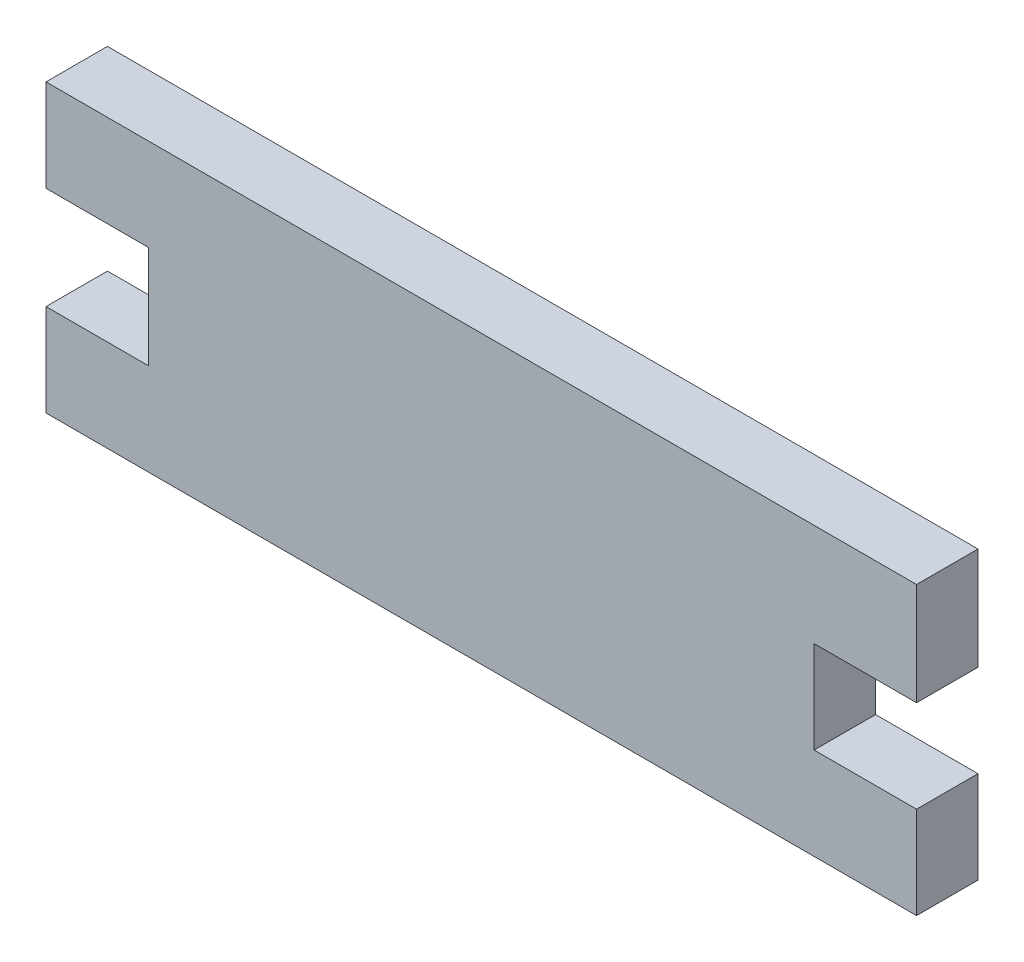
ISO-10303-21;
HEADER;
FILE_DESCRIPTION(('STEP AP214'),'2;1');
FILE_NAME('part.step','',(''),(''),'','','');
FILE_SCHEMA(('AUTOMOTIVE_DESIGN { 1 0 10303 214 1 1 1 1 }'));
ENDSEC;
DATA;
#1=APPLICATION_CONTEXT('core data for automotive mechanical design processes');
#2=APPLICATION_PROTOCOL_DEFINITION('international standard','automotive_design',2000,#1);
#3=PRODUCT_CONTEXT('',#1,'mechanical');
#4=PRODUCT('Part','Part','',(#3));
#5=PRODUCT_RELATED_PRODUCT_CATEGORY('part','',(#4));
#6=PRODUCT_DEFINITION_FORMATION('','',#4);
#7=PRODUCT_DEFINITION_CONTEXT('part definition',#1,'design');
#8=PRODUCT_DEFINITION('design','',#6,#7);
#9=PRODUCT_DEFINITION_SHAPE('','',#8);
#10=(LENGTH_UNIT() NAMED_UNIT(*) SI_UNIT(.MILLI.,.METRE.));
#11=(NAMED_UNIT(*) PLANE_ANGLE_UNIT() SI_UNIT($,.RADIAN.));
#12=(NAMED_UNIT(*) SI_UNIT($,.STERADIAN.) SOLID_ANGLE_UNIT());
#13=UNCERTAINTY_MEASURE_WITH_UNIT(LENGTH_MEASURE(1.E-05),#10,'distance_accuracy_value','');
#14=(GEOMETRIC_REPRESENTATION_CONTEXT(3) GLOBAL_UNCERTAINTY_ASSIGNED_CONTEXT((#13)) GLOBAL_UNIT_ASSIGNED_CONTEXT((#10,
#11,#12)) REPRESENTATION_CONTEXT('',''));
#15=CARTESIAN_POINT('',(0.,0.,0.));
#16=DIRECTION('',(0.,0.,1.));
#17=DIRECTION('',(1.,0.,0.));
#18=AXIS2_PLACEMENT_3D('',#15,#16,#17);
#19=CARTESIAN_POINT('',(-16.5096417663684,7.16357235269553,3.));
#20=DIRECTION('',(1.,0.,0.));
#21=DIRECTION('',(0.,0.,-1.));
#22=AXIS2_PLACEMENT_3D('',#19,#20,#21);
#23=PLANE('',#22);
#24=DIRECTION('',(0.,-1.,0.));
#25=VECTOR('',#24,1.);
#26=CARTESIAN_POINT('',(-16.5096417663684,7.16357235269553,0.));
#27=LINE('',#26,#25);
#28=CARTESIAN_POINT('',(-16.5096417663684,7.16357235269553,0.));
#29=VERTEX_POINT('',#28);
#30=CARTESIAN_POINT('',(-16.5096417663684,2.66357235269553,0.));
#31=VERTEX_POINT('',#30);
#32=EDGE_CURVE('E157',#29,#31,#27,.T.);
#33=ORIENTED_EDGE('',*,*,#32,.T.);
#34=DIRECTION('',(0.,0.,-1.));
#35=VECTOR('',#34,1.);
#36=CARTESIAN_POINT('',(-16.5096417663684,2.66357235269553,3.));
#37=LINE('',#36,#35);
#38=CARTESIAN_POINT('',(-16.5096417663684,2.66357235269553,3.));
#39=VERTEX_POINT('',#38);
#40=EDGE_CURVE('E11',#39,#31,#37,.T.);
#41=ORIENTED_EDGE('',*,*,#40,.F.);
#42=DIRECTION('',(0.,-1.,0.));
#43=VECTOR('',#42,1.);
#44=CARTESIAN_POINT('',(-16.5096417663684,7.16357235269553,3.));
#45=LINE('',#44,#43);
#46=CARTESIAN_POINT('',(-16.5096417663684,7.16357235269553,3.));
#47=VERTEX_POINT('',#46);
#48=EDGE_CURVE('E179',#47,#39,#45,.T.);
#49=ORIENTED_EDGE('',*,*,#48,.F.);
#50=DIRECTION('',(0.,0.,-1.));
#51=VECTOR('',#50,1.);
#52=CARTESIAN_POINT('',(-16.5096417663684,7.16357235269553,3.));
#53=LINE('',#52,#51);
#54=EDGE_CURVE('E153',#47,#29,#53,.T.);
#55=ORIENTED_EDGE('',*,*,#54,.T.);
#56=EDGE_LOOP('',(#33,#41,#49,#55));
#57=FACE_BOUND('',#56,.T.);
#58=ADVANCED_FACE('F37',(#57),#23,.F.);
#59=CARTESIAN_POINT('',(-16.5096417663684,2.66357235269553,3.));
#60=DIRECTION('',(0.,1.,0.));
#61=DIRECTION('',(-1.,0.,0.));
#62=AXIS2_PLACEMENT_3D('',#59,#60,#61);
#63=PLANE('',#62);
#64=DIRECTION('',(1.,0.,0.));
#65=VECTOR('',#64,1.);
#66=CARTESIAN_POINT('',(-16.5096417663684,2.66357235269553,0.));
#67=LINE('',#66,#65);
#68=CARTESIAN_POINT('',(-11.5096417663684,2.66357235269553,0.));
#69=VERTEX_POINT('',#68);
#70=EDGE_CURVE('E160',#31,#69,#67,.T.);
#71=ORIENTED_EDGE('',*,*,#70,.T.);
#72=DIRECTION('',(0.,0.,-1.));
#73=VECTOR('',#72,1.);
#74=CARTESIAN_POINT('',(-11.5096417663684,2.66357235269553,3.));
#75=LINE('',#74,#73);
#76=CARTESIAN_POINT('',(-11.5096417663684,2.66357235269553,3.));
#77=VERTEX_POINT('',#76);
#78=EDGE_CURVE('E45',#77,#69,#75,.T.);
#79=ORIENTED_EDGE('',*,*,#78,.F.);
#80=DIRECTION('',(1.,0.,0.));
#81=VECTOR('',#80,1.);
#82=CARTESIAN_POINT('',(-16.5096417663684,2.66357235269553,3.));
#83=LINE('',#82,#81);
#84=EDGE_CURVE('E108',#39,#77,#83,.T.);
#85=ORIENTED_EDGE('',*,*,#84,.F.);
#86=ORIENTED_EDGE('',*,*,#40,.T.);
#87=EDGE_LOOP('',(#71,#79,#85,#86));
#88=FACE_BOUND('',#87,.T.);
#89=ADVANCED_FACE('F257',(#88),#63,.F.);
#90=CARTESIAN_POINT('',(-11.5096417663684,2.66357235269553,3.));
#91=DIRECTION('',(1.,0.,0.));
#92=DIRECTION('',(0.,1.,0.));
#93=AXIS2_PLACEMENT_3D('',#90,#91,#92);
#94=PLANE('',#93);
#95=DIRECTION('',(0.,-1.,0.));
#96=VECTOR('',#95,1.);
#97=CARTESIAN_POINT('',(-11.5096417663684,2.66357235269553,0.));
#98=LINE('',#97,#96);
#99=CARTESIAN_POINT('',(-11.5096417663684,-2.33642764730447,0.));
#100=VERTEX_POINT('',#99);
#101=EDGE_CURVE('E162',#69,#100,#98,.T.);
#102=ORIENTED_EDGE('',*,*,#101,.T.);
#103=DIRECTION('',(0.,0.,-1.));
#104=VECTOR('',#103,1.);
#105=CARTESIAN_POINT('',(-11.5096417663684,-2.33642764730447,3.));
#106=LINE('',#105,#104);
#107=CARTESIAN_POINT('',(-11.5096417663684,-2.33642764730447,3.));
#108=VERTEX_POINT('',#107);
#109=EDGE_CURVE('E198',#108,#100,#106,.T.);
#110=ORIENTED_EDGE('',*,*,#109,.F.);
#111=DIRECTION('',(0.,-1.,0.));
#112=VECTOR('',#111,1.);
#113=CARTESIAN_POINT('',(-11.5096417663684,2.66357235269553,3.));
#114=LINE('',#113,#112);
#115=EDGE_CURVE('E206',#77,#108,#114,.T.);
#116=ORIENTED_EDGE('',*,*,#115,.F.);
#117=ORIENTED_EDGE('',*,*,#78,.T.);
#118=EDGE_LOOP('',(#102,#110,#116,#117));
#119=FACE_BOUND('',#118,.T.);
#120=ADVANCED_FACE('F204',(#119),#94,.F.);
#121=CARTESIAN_POINT('',(-16.5096417663684,-2.33642764730447,3.));
#122=DIRECTION('',(0.,-1.,0.));
#123=DIRECTION('',(1.,0.,0.));
#124=AXIS2_PLACEMENT_3D('',#121,#122,#123);
#125=PLANE('',#124);
#126=DIRECTION('',(-1.,0.,0.));
#127=VECTOR('',#126,1.);
#128=CARTESIAN_POINT('',(-16.5096417663684,-2.33642764730447,0.));
#129=LINE('',#128,#127);
#130=CARTESIAN_POINT('',(-16.5096417663684,-2.33642764730447,0.));
#131=VERTEX_POINT('',#130);
#132=EDGE_CURVE('E164',#100,#131,#129,.T.);
#133=ORIENTED_EDGE('',*,*,#132,.T.);
#134=DIRECTION('',(0.,0.,-1.));
#135=VECTOR('',#134,1.);
#136=CARTESIAN_POINT('',(-16.5096417663684,-2.33642764730447,3.));
#137=LINE('',#136,#135);
#138=CARTESIAN_POINT('',(-16.5096417663684,-2.33642764730447,3.));
#139=VERTEX_POINT('',#138);
#140=EDGE_CURVE('E195',#139,#131,#137,.T.);
#141=ORIENTED_EDGE('',*,*,#140,.F.);
#142=DIRECTION('',(-1.,0.,0.));
#143=VECTOR('',#142,1.);
#144=CARTESIAN_POINT('',(-16.5096417663684,-2.33642764730447,3.));
#145=LINE('',#144,#143);
#146=EDGE_CURVE('E224',#108,#139,#145,.T.);
#147=ORIENTED_EDGE('',*,*,#146,.F.);
#148=ORIENTED_EDGE('',*,*,#109,.T.);
#149=EDGE_LOOP('',(#133,#141,#147,#148));
#150=FACE_BOUND('',#149,.T.);
#151=ADVANCED_FACE('F215',(#150),#125,.F.);
#152=CARTESIAN_POINT('',(-16.5096417663684,-2.33642764730447,3.));
#153=DIRECTION('',(1.,0.,0.));
#154=DIRECTION('',(0.,0.,-1.));
#155=AXIS2_PLACEMENT_3D('',#152,#153,#154);
#156=PLANE('',#155);
#157=DIRECTION('',(0.,-1.,0.));
#158=VECTOR('',#157,1.);
#159=CARTESIAN_POINT('',(-16.5096417663684,-2.33642764730447,0.));
#160=LINE('',#159,#158);
#161=CARTESIAN_POINT('',(-16.5096417663684,-6.83642764730447,0.));
#162=VERTEX_POINT('',#161);
#163=EDGE_CURVE('E166',#131,#162,#160,.T.);
#164=ORIENTED_EDGE('',*,*,#163,.T.);
#165=DIRECTION('',(0.,0.,-1.));
#166=VECTOR('',#165,1.);
#167=CARTESIAN_POINT('',(-16.5096417663684,-6.83642764730447,3.));
#168=LINE('',#167,#166);
#169=CARTESIAN_POINT('',(-16.5096417663684,-6.83642764730447,3.));
#170=VERTEX_POINT('',#169);
#171=EDGE_CURVE('E192',#170,#162,#168,.T.);
#172=ORIENTED_EDGE('',*,*,#171,.F.);
#173=DIRECTION('',(0.,-1.,0.));
#174=VECTOR('',#173,1.);
#175=CARTESIAN_POINT('',(-16.5096417663684,-2.33642764730447,3.));
#176=LINE('',#175,#174);
#177=EDGE_CURVE('E221',#139,#170,#176,.T.);
#178=ORIENTED_EDGE('',*,*,#177,.F.);
#179=ORIENTED_EDGE('',*,*,#140,.T.);
#180=EDGE_LOOP('',(#164,#172,#178,#179));
#181=FACE_BOUND('',#180,.T.);
#182=ADVANCED_FACE('F219',(#181),#156,.F.);
#183=CARTESIAN_POINT('',(-16.5096417663684,-6.83642764730447,3.));
#184=DIRECTION('',(0.,1.,0.));
#185=DIRECTION('',(0.,0.,1.));
#186=AXIS2_PLACEMENT_3D('',#183,#184,#185);
#187=PLANE('',#186);
#188=DIRECTION('',(1.,0.,0.));
#189=VECTOR('',#188,1.);
#190=CARTESIAN_POINT('',(-16.5096417663684,-6.83642764730447,0.));
#191=LINE('',#190,#189);
#192=CARTESIAN_POINT('',(25.9903582336316,-6.83642764730447,0.));
#193=VERTEX_POINT('',#192);
#194=EDGE_CURVE('E168',#162,#193,#191,.T.);
#195=ORIENTED_EDGE('',*,*,#194,.T.);
#196=DIRECTION('',(0.,0.,-1.));
#197=VECTOR('',#196,1.);
#198=CARTESIAN_POINT('',(25.9903582336316,-6.83642764730447,3.));
#199=LINE('',#198,#197);
#200=CARTESIAN_POINT('',(25.9903582336316,-6.83642764730447,3.));
#201=VERTEX_POINT('',#200);
#202=EDGE_CURVE('E189',#201,#193,#199,.T.);
#203=ORIENTED_EDGE('',*,*,#202,.F.);
#204=DIRECTION('',(1.,0.,0.));
#205=VECTOR('',#204,1.);
#206=CARTESIAN_POINT('',(-16.5096417663684,-6.83642764730447,3.));
#207=LINE('',#206,#205);
#208=EDGE_CURVE('E223',#170,#201,#207,.T.);
#209=ORIENTED_EDGE('',*,*,#208,.F.);
#210=ORIENTED_EDGE('',*,*,#171,.T.);
#211=EDGE_LOOP('',(#195,#203,#209,#210));
#212=FACE_BOUND('',#211,.T.);
#213=ADVANCED_FACE('F270',(#212),#187,.F.);
#214=CARTESIAN_POINT('',(25.9903582336316,-2.33642764730447,3.));
#215=DIRECTION('',(-1.,0.,0.));
#216=DIRECTION('',(0.,-1.,0.));
#217=AXIS2_PLACEMENT_3D('',#214,#215,#216);
#218=PLANE('',#217);
#219=DIRECTION('',(0.,1.,0.));
#220=VECTOR('',#219,1.);
#221=CARTESIAN_POINT('',(25.9903582336316,-2.33642764730447,0.));
#222=LINE('',#221,#220);
#223=CARTESIAN_POINT('',(25.9903582336316,-2.33642764730447,0.));
#224=VERTEX_POINT('',#223);
#225=EDGE_CURVE('E170',#193,#224,#222,.T.);
#226=ORIENTED_EDGE('',*,*,#225,.T.);
#227=DIRECTION('',(0.,0.,-1.));
#228=VECTOR('',#227,1.);
#229=CARTESIAN_POINT('',(25.9903582336316,-2.33642764730447,3.));
#230=LINE('',#229,#228);
#231=CARTESIAN_POINT('',(25.9903582336316,-2.33642764730447,3.));
#232=VERTEX_POINT('',#231);
#233=EDGE_CURVE('E186',#232,#224,#230,.T.);
#234=ORIENTED_EDGE('',*,*,#233,.F.);
#235=DIRECTION('',(0.,1.,0.));
#236=VECTOR('',#235,1.);
#237=CARTESIAN_POINT('',(25.9903582336316,-2.33642764730447,3.));
#238=LINE('',#237,#236);
#239=EDGE_CURVE('E226',#201,#232,#238,.T.);
#240=ORIENTED_EDGE('',*,*,#239,.F.);
#241=ORIENTED_EDGE('',*,*,#202,.T.);
#242=EDGE_LOOP('',(#226,#234,#240,#241));
#243=FACE_BOUND('',#242,.T.);
#244=ADVANCED_FACE('F273',(#243),#218,.F.);
#245=CARTESIAN_POINT('',(25.9903582336316,-2.33642764730447,3.));
#246=DIRECTION('',(0.,-1.,0.));
#247=DIRECTION('',(1.,0.,0.));
#248=AXIS2_PLACEMENT_3D('',#245,#246,#247);
#249=PLANE('',#248);
#250=DIRECTION('',(-1.,0.,0.));
#251=VECTOR('',#250,1.);
#252=CARTESIAN_POINT('',(25.9903582336316,-2.33642764730447,0.));
#253=LINE('',#252,#251);
#254=CARTESIAN_POINT('',(20.9903582336316,-2.33642764730447,0.));
#255=VERTEX_POINT('',#254);
#256=EDGE_CURVE('E172',#224,#255,#253,.T.);
#257=ORIENTED_EDGE('',*,*,#256,.T.);
#258=DIRECTION('',(0.,0.,-1.));
#259=VECTOR('',#258,1.);
#260=CARTESIAN_POINT('',(20.9903582336316,-2.33642764730447,3.));
#261=LINE('',#260,#259);
#262=CARTESIAN_POINT('',(20.9903582336316,-2.33642764730447,3.));
#263=VERTEX_POINT('',#262);
#264=EDGE_CURVE('E183',#263,#255,#261,.T.);
#265=ORIENTED_EDGE('',*,*,#264,.F.);
#266=DIRECTION('',(-1.,0.,0.));
#267=VECTOR('',#266,1.);
#268=CARTESIAN_POINT('',(25.9903582336316,-2.33642764730447,3.));
#269=LINE('',#268,#267);
#270=EDGE_CURVE('E232',#232,#263,#269,.T.);
#271=ORIENTED_EDGE('',*,*,#270,.F.);
#272=ORIENTED_EDGE('',*,*,#233,.T.);
#273=EDGE_LOOP('',(#257,#265,#271,#272));
#274=FACE_BOUND('',#273,.T.);
#275=ADVANCED_FACE('F238',(#274),#249,.F.);
#276=CARTESIAN_POINT('',(20.9903582336316,2.16357235269553,3.));
#277=DIRECTION('',(-1.,0.,0.));
#278=DIRECTION('',(0.,-1.,0.));
#279=AXIS2_PLACEMENT_3D('',#276,#277,#278);
#280=PLANE('',#279);
#281=DIRECTION('',(0.,1.,0.));
#282=VECTOR('',#281,1.);
#283=CARTESIAN_POINT('',(20.9903582336316,2.16357235269553,0.));
#284=LINE('',#283,#282);
#285=CARTESIAN_POINT('',(20.9903582336316,2.16357235269553,0.));
#286=VERTEX_POINT('',#285);
#287=EDGE_CURVE('E174',#255,#286,#284,.T.);
#288=ORIENTED_EDGE('',*,*,#287,.T.);
#289=DIRECTION('',(0.,0.,-1.));
#290=VECTOR('',#289,1.);
#291=CARTESIAN_POINT('',(20.9903582336316,2.16357235269553,3.));
#292=LINE('',#291,#290);
#293=CARTESIAN_POINT('',(20.9903582336316,2.16357235269553,3.));
#294=VERTEX_POINT('',#293);
#295=EDGE_CURVE('E148',#294,#286,#292,.T.);
#296=ORIENTED_EDGE('',*,*,#295,.F.);
#297=DIRECTION('',(0.,1.,0.));
#298=VECTOR('',#297,1.);
#299=CARTESIAN_POINT('',(20.9903582336316,2.16357235269553,3.));
#300=LINE('',#299,#298);
#301=EDGE_CURVE('E139',#263,#294,#300,.T.);
#302=ORIENTED_EDGE('',*,*,#301,.F.);
#303=ORIENTED_EDGE('',*,*,#264,.T.);
#304=EDGE_LOOP('',(#288,#296,#302,#303));
#305=FACE_BOUND('',#304,.T.);
#306=ADVANCED_FACE('F242',(#305),#280,.F.);
#307=CARTESIAN_POINT('',(25.9903582336316,2.16357235269553,3.));
#308=DIRECTION('',(0.,1.,0.));
#309=DIRECTION('',(0.,0.,1.));
#310=AXIS2_PLACEMENT_3D('',#307,#308,#309);
#311=PLANE('',#310);
#312=DIRECTION('',(1.,0.,0.));
#313=VECTOR('',#312,1.);
#314=CARTESIAN_POINT('',(25.9903582336316,2.16357235269553,0.));
#315=LINE('',#314,#313);
#316=CARTESIAN_POINT('',(25.9903582336316,2.16357235269553,0.));
#317=VERTEX_POINT('',#316);
#318=EDGE_CURVE('E147',#286,#317,#315,.T.);
#319=ORIENTED_EDGE('',*,*,#318,.T.);
#320=DIRECTION('',(0.,0.,-1.));
#321=VECTOR('',#320,1.);
#322=CARTESIAN_POINT('',(25.9903582336316,2.16357235269553,3.));
#323=LINE('',#322,#321);
#324=CARTESIAN_POINT('',(25.9903582336316,2.16357235269553,3.));
#325=VERTEX_POINT('',#324);
#326=EDGE_CURVE('E144',#325,#317,#323,.T.);
#327=ORIENTED_EDGE('',*,*,#326,.F.);
#328=DIRECTION('',(1.,0.,0.));
#329=VECTOR('',#328,1.);
#330=CARTESIAN_POINT('',(25.9903582336316,2.16357235269553,3.));
#331=LINE('',#330,#329);
#332=EDGE_CURVE('E133',#294,#325,#331,.T.);
#333=ORIENTED_EDGE('',*,*,#332,.F.);
#334=ORIENTED_EDGE('',*,*,#295,.T.);
#335=EDGE_LOOP('',(#319,#327,#333,#334));
#336=FACE_BOUND('',#335,.T.);
#337=ADVANCED_FACE('F145',(#336),#311,.F.);
#338=CARTESIAN_POINT('',(25.9903582336316,7.16357235269553,3.));
#339=DIRECTION('',(-1.,0.,0.));
#340=DIRECTION('',(0.,0.,1.));
#341=AXIS2_PLACEMENT_3D('',#338,#339,#340);
#342=PLANE('',#341);
#343=DIRECTION('',(0.,1.,0.));
#344=VECTOR('',#343,1.);
#345=CARTESIAN_POINT('',(25.9903582336316,7.16357235269553,0.));
#346=LINE('',#345,#344);
#347=CARTESIAN_POINT('',(25.9903582336316,7.16357235269553,0.));
#348=VERTEX_POINT('',#347);
#349=EDGE_CURVE('E94',#317,#348,#346,.T.);
#350=ORIENTED_EDGE('',*,*,#349,.T.);
#351=DIRECTION('',(0.,0.,-1.));
#352=VECTOR('',#351,1.);
#353=CARTESIAN_POINT('',(25.9903582336316,7.16357235269553,3.));
#354=LINE('',#353,#352);
#355=CARTESIAN_POINT('',(25.9903582336316,7.16357235269553,3.));
#356=VERTEX_POINT('',#355);
#357=EDGE_CURVE('E149',#356,#348,#354,.T.);
#358=ORIENTED_EDGE('',*,*,#357,.F.);
#359=DIRECTION('',(0.,1.,0.));
#360=VECTOR('',#359,1.);
#361=CARTESIAN_POINT('',(25.9903582336316,7.16357235269553,3.));
#362=LINE('',#361,#360);
#363=EDGE_CURVE('E137',#325,#356,#362,.T.);
#364=ORIENTED_EDGE('',*,*,#363,.F.);
#365=ORIENTED_EDGE('',*,*,#326,.T.);
#366=EDGE_LOOP('',(#350,#358,#364,#365));
#367=FACE_BOUND('',#366,.T.);
#368=ADVANCED_FACE('F151',(#367),#342,.F.);
#369=CARTESIAN_POINT('',(-16.5096417663684,7.16357235269553,3.));
#370=DIRECTION('',(0.,-1.,0.));
#371=DIRECTION('',(1.,0.,0.));
#372=AXIS2_PLACEMENT_3D('',#369,#370,#371);
#373=PLANE('',#372);
#374=DIRECTION('',(-1.,0.,0.));
#375=VECTOR('',#374,1.);
#376=CARTESIAN_POINT('',(-16.5096417663684,7.16357235269553,0.));
#377=LINE('',#376,#375);
#378=EDGE_CURVE('E100',#348,#29,#377,.T.);
#379=ORIENTED_EDGE('',*,*,#378,.T.);
#380=ORIENTED_EDGE('',*,*,#54,.F.);
#381=DIRECTION('',(-1.,0.,0.));
#382=VECTOR('',#381,1.);
#383=CARTESIAN_POINT('',(-16.5096417663684,7.16357235269553,3.));
#384=LINE('',#383,#382);
#385=EDGE_CURVE('E53',#356,#47,#384,.T.);
#386=ORIENTED_EDGE('',*,*,#385,.F.);
#387=ORIENTED_EDGE('',*,*,#357,.T.);
#388=EDGE_LOOP('',(#379,#380,#386,#387));
#389=FACE_BOUND('',#388,.T.);
#390=ADVANCED_FACE('F246',(#389),#373,.F.);
#391=CARTESIAN_POINT('',(0.,0.,3.));
#392=DIRECTION('',(0.,0.,1.));
#393=DIRECTION('',(1.,0.,0.));
#394=AXIS2_PLACEMENT_3D('',#391,#392,#393);
#395=PLANE('',#394);
#396=ORIENTED_EDGE('',*,*,#48,.T.);
#397=ORIENTED_EDGE('',*,*,#84,.T.);
#398=ORIENTED_EDGE('',*,*,#115,.T.);
#399=ORIENTED_EDGE('',*,*,#146,.T.);
#400=ORIENTED_EDGE('',*,*,#177,.T.);
#401=ORIENTED_EDGE('',*,*,#208,.T.);
#402=ORIENTED_EDGE('',*,*,#239,.T.);
#403=ORIENTED_EDGE('',*,*,#270,.T.);
#404=ORIENTED_EDGE('',*,*,#301,.T.);
#405=ORIENTED_EDGE('',*,*,#332,.T.);
#406=ORIENTED_EDGE('',*,*,#363,.T.);
#407=ORIENTED_EDGE('',*,*,#385,.T.);
#408=EDGE_LOOP('',(#396,#397,#398,#399,#400,#401,#402,#403,#404,#405,#406,#407));
#409=FACE_BOUND('',#408,.T.);
#410=ADVANCED_FACE('F135',(#409),#395,.T.);
#411=CARTESIAN_POINT('',(0.,0.,0.));
#412=DIRECTION('',(0.,0.,1.));
#413=DIRECTION('',(1.,0.,0.));
#414=AXIS2_PLACEMENT_3D('',#411,#412,#413);
#415=PLANE('',#414);
#416=ORIENTED_EDGE('',*,*,#32,.F.);
#417=ORIENTED_EDGE('',*,*,#378,.F.);
#418=ORIENTED_EDGE('',*,*,#349,.F.);
#419=ORIENTED_EDGE('',*,*,#318,.F.);
#420=ORIENTED_EDGE('',*,*,#287,.F.);
#421=ORIENTED_EDGE('',*,*,#256,.F.);
#422=ORIENTED_EDGE('',*,*,#225,.F.);
#423=ORIENTED_EDGE('',*,*,#194,.F.);
#424=ORIENTED_EDGE('',*,*,#163,.F.);
#425=ORIENTED_EDGE('',*,*,#132,.F.);
#426=ORIENTED_EDGE('',*,*,#101,.F.);
#427=ORIENTED_EDGE('',*,*,#70,.F.);
#428=EDGE_LOOP('',(#416,#417,#418,#419,#420,#421,#422,#423,#424,#425,#426,#427));
#429=FACE_BOUND('',#428,.T.);
#430=ADVANCED_FACE('F210',(#429),#415,.F.);
#431=CLOSED_SHELL('',(#58,#89,#120,#151,#182,#213,#244,#275,#306,#337,#368,#390,#410,#430));
#432=MANIFOLD_SOLID_BREP('B2',#431);
#433=ADVANCED_BREP_SHAPE_REPRESENTATION('',(#18,#432),#14);
#434=SHAPE_DEFINITION_REPRESENTATION(#9,#433);
ENDSEC;
END-ISO-10303-21;
